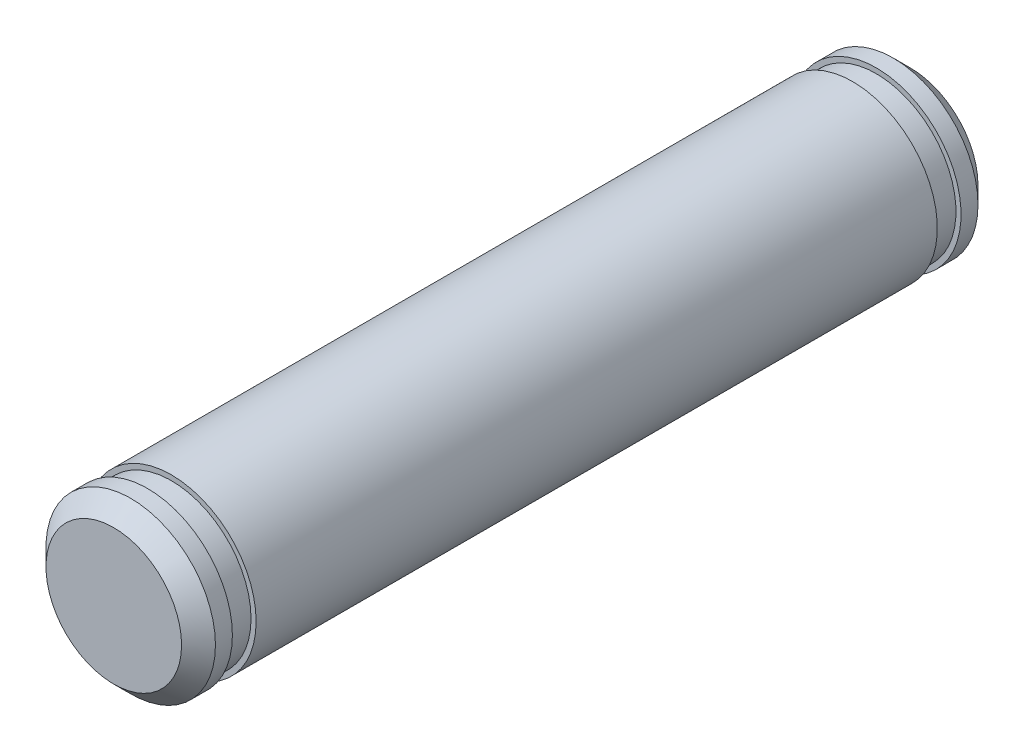
ISO-10303-21;
HEADER;
FILE_DESCRIPTION(('STEP AP214'),'2;1');
FILE_NAME('part.step','',(''),(''),'','','');
FILE_SCHEMA(('AUTOMOTIVE_DESIGN { 1 0 10303 214 1 1 1 1 }'));
ENDSEC;
DATA;
#1=APPLICATION_CONTEXT('core data for automotive mechanical design processes');
#2=APPLICATION_PROTOCOL_DEFINITION('international standard','automotive_design',2000,#1);
#3=PRODUCT_CONTEXT('',#1,'mechanical');
#4=PRODUCT('Part','Part','',(#3));
#5=PRODUCT_RELATED_PRODUCT_CATEGORY('part','',(#4));
#6=PRODUCT_DEFINITION_FORMATION('','',#4);
#7=PRODUCT_DEFINITION_CONTEXT('part definition',#1,'design');
#8=PRODUCT_DEFINITION('design','',#6,#7);
#9=PRODUCT_DEFINITION_SHAPE('','',#8);
#10=(LENGTH_UNIT() NAMED_UNIT(*) SI_UNIT(.MILLI.,.METRE.));
#11=(NAMED_UNIT(*) PLANE_ANGLE_UNIT() SI_UNIT($,.RADIAN.));
#12=(NAMED_UNIT(*) SI_UNIT($,.STERADIAN.) SOLID_ANGLE_UNIT());
#13=UNCERTAINTY_MEASURE_WITH_UNIT(LENGTH_MEASURE(1.E-05),#10,'distance_accuracy_value','');
#14=(GEOMETRIC_REPRESENTATION_CONTEXT(3) GLOBAL_UNCERTAINTY_ASSIGNED_CONTEXT((#13)) GLOBAL_UNIT_ASSIGNED_CONTEXT((#10,
#11,#12)) REPRESENTATION_CONTEXT('',''));
#15=CARTESIAN_POINT('',(0.,0.,0.));
#16=DIRECTION('',(0.,0.,1.));
#17=DIRECTION('',(1.,0.,0.));
#18=AXIS2_PLACEMENT_3D('',#15,#16,#17);
#19=CARTESIAN_POINT('',(0.,0.,23.5));
#20=DIRECTION('',(0.,0.,-1.));
#21=DIRECTION('',(-1.,0.,0.));
#22=AXIS2_PLACEMENT_3D('',#19,#20,#21);
#23=CYLINDRICAL_SURFACE('',#22,2.5);
#24=CARTESIAN_POINT('',(0.,0.,21.8));
#25=DIRECTION('',(0.,0.,1.));
#26=DIRECTION('',(1.,0.,0.));
#27=AXIS2_PLACEMENT_3D('',#24,#25,#26);
#28=CIRCLE('',#27,2.5);
#29=CARTESIAN_POINT('',(2.5,0.,21.8));
#30=VERTEX_POINT('',#29);
#31=EDGE_CURVE('E54',#30,#30,#28,.T.);
#32=ORIENTED_EDGE('',*,*,#31,.F.);
#33=EDGE_LOOP('',(#32));
#34=FACE_BOUND('',#33,.T.);
#35=CARTESIAN_POINT('',(0.,0.,1.7));
#36=DIRECTION('',(0.,0.,-1.));
#37=DIRECTION('',(-1.,0.,0.));
#38=AXIS2_PLACEMENT_3D('',#35,#36,#37);
#39=CIRCLE('',#38,2.5);
#40=CARTESIAN_POINT('',(-2.5,0.,1.7));
#41=VERTEX_POINT('',#40);
#42=EDGE_CURVE('E64',#41,#41,#39,.T.);
#43=ORIENTED_EDGE('',*,*,#42,.F.);
#44=EDGE_LOOP('',(#43));
#45=FACE_BOUND('',#44,.T.);
#46=ADVANCED_FACE('F33',(#34,#45),#23,.T.);
#47=CARTESIAN_POINT('',(0.,0.,21.8));
#48=DIRECTION('',(0.,0.,1.));
#49=DIRECTION('',(1.,0.,0.));
#50=AXIS2_PLACEMENT_3D('',#47,#48,#49);
#51=PLANE('',#50);
#52=CARTESIAN_POINT('',(0.,0.,21.8));
#53=DIRECTION('',(0.,0.,1.));
#54=DIRECTION('',(1.,0.,0.));
#55=AXIS2_PLACEMENT_3D('',#52,#53,#54);
#56=CIRCLE('',#55,2.35);
#57=CARTESIAN_POINT('',(2.35,0.,21.8));
#58=VERTEX_POINT('',#57);
#59=EDGE_CURVE('E58',#58,#58,#56,.T.);
#60=ORIENTED_EDGE('',*,*,#59,.F.);
#61=EDGE_LOOP('',(#60));
#62=FACE_BOUND('',#61,.T.);
#63=ORIENTED_EDGE('',*,*,#31,.T.);
#64=EDGE_LOOP('',(#63));
#65=FACE_BOUND('',#64,.T.);
#66=ADVANCED_FACE('F91',(#62,#65),#51,.T.);
#67=CARTESIAN_POINT('',(0.,0.,22.5));
#68=DIRECTION('',(0.,0.,1.));
#69=DIRECTION('',(1.,0.,0.));
#70=AXIS2_PLACEMENT_3D('',#67,#68,#69);
#71=PLANE('',#70);
#72=CARTESIAN_POINT('',(0.,0.,22.5));
#73=DIRECTION('',(0.,0.,1.));
#74=DIRECTION('',(1.,0.,0.));
#75=AXIS2_PLACEMENT_3D('',#72,#73,#74);
#76=CIRCLE('',#75,2.35);
#77=CARTESIAN_POINT('',(2.35,0.,22.5));
#78=VERTEX_POINT('',#77);
#79=EDGE_CURVE('E61',#78,#78,#76,.T.);
#80=ORIENTED_EDGE('',*,*,#79,.T.);
#81=EDGE_LOOP('',(#80));
#82=FACE_BOUND('',#81,.T.);
#83=CARTESIAN_POINT('',(0.,0.,22.5));
#84=DIRECTION('',(0.,0.,1.));
#85=DIRECTION('',(1.,0.,0.));
#86=AXIS2_PLACEMENT_3D('',#83,#84,#85);
#87=CIRCLE('',#86,2.5);
#88=CARTESIAN_POINT('',(2.5,0.,22.5));
#89=VERTEX_POINT('',#88);
#90=EDGE_CURVE('E55',#89,#89,#87,.T.);
#91=ORIENTED_EDGE('',*,*,#90,.F.);
#92=EDGE_LOOP('',(#91));
#93=FACE_BOUND('',#92,.T.);
#94=ADVANCED_FACE('F98',(#82,#93),#71,.F.);
#95=CARTESIAN_POINT('',(0.,0.,21.8));
#96=DIRECTION('',(0.,0.,1.));
#97=DIRECTION('',(1.,0.,0.));
#98=AXIS2_PLACEMENT_3D('',#95,#96,#97);
#99=CYLINDRICAL_SURFACE('',#98,2.35);
#100=ORIENTED_EDGE('',*,*,#59,.T.);
#101=EDGE_LOOP('',(#100));
#102=FACE_BOUND('',#101,.T.);
#103=ORIENTED_EDGE('',*,*,#79,.F.);
#104=EDGE_LOOP('',(#103));
#105=FACE_BOUND('',#104,.T.);
#106=ADVANCED_FACE('F119',(#102,#105),#99,.T.);
#107=CARTESIAN_POINT('',(0.,0.,23.5));
#108=DIRECTION('',(0.,0.,1.));
#109=DIRECTION('',(1.,0.,0.));
#110=AXIS2_PLACEMENT_3D('',#107,#108,#109);
#111=PLANE('',#110);
#112=CARTESIAN_POINT('',(0.,0.,23.5));
#113=DIRECTION('',(0.,0.,1.));
#114=DIRECTION('',(1.,0.,0.));
#115=AXIS2_PLACEMENT_3D('',#112,#113,#114);
#116=CIRCLE('',#115,2.);
#117=CARTESIAN_POINT('',(2.,0.,23.5));
#118=VERTEX_POINT('',#117);
#119=EDGE_CURVE('E10',#118,#118,#116,.T.);
#120=ORIENTED_EDGE('',*,*,#119,.T.);
#121=EDGE_LOOP('',(#120));
#122=FACE_BOUND('',#121,.T.);
#123=ADVANCED_FACE('F111',(#122),#111,.T.);
#124=CARTESIAN_POINT('',(0.,0.,23.5));
#125=DIRECTION('',(0.,0.,-1.));
#126=DIRECTION('',(-1.,0.,0.));
#127=AXIS2_PLACEMENT_3D('',#124,#125,#126);
#128=CONICAL_SURFACE('',#127,2.,0.785398163397446);
#129=CARTESIAN_POINT('',(0.,0.,23.));
#130=DIRECTION('',(0.,0.,1.));
#131=DIRECTION('',(1.,0.,0.));
#132=AXIS2_PLACEMENT_3D('',#129,#130,#131);
#133=CIRCLE('',#132,2.5);
#134=CARTESIAN_POINT('',(2.5,0.,23.));
#135=VERTEX_POINT('',#134);
#136=EDGE_CURVE('E49',#135,#135,#133,.F.);
#137=ORIENTED_EDGE('',*,*,#136,.F.);
#138=EDGE_LOOP('',(#137));
#139=FACE_BOUND('',#138,.T.);
#140=ORIENTED_EDGE('',*,*,#119,.F.);
#141=EDGE_LOOP('',(#140));
#142=FACE_BOUND('',#141,.T.);
#143=ADVANCED_FACE('F36',(#139,#142),#128,.T.);
#144=ORIENTED_EDGE('',*,*,#90,.T.);
#145=EDGE_LOOP('',(#144));
#146=FACE_BOUND('',#145,.T.);
#147=ORIENTED_EDGE('',*,*,#136,.T.);
#148=EDGE_LOOP('',(#147));
#149=FACE_BOUND('',#148,.T.);
#150=ADVANCED_FACE('F86',(#146,#149),#23,.T.);
#151=CARTESIAN_POINT('',(0.,0.,1.7));
#152=DIRECTION('',(0.,0.,-1.));
#153=DIRECTION('',(-1.,0.,0.));
#154=AXIS2_PLACEMENT_3D('',#151,#152,#153);
#155=PLANE('',#154);
#156=CARTESIAN_POINT('',(0.,0.,1.7));
#157=DIRECTION('',(0.,0.,-1.));
#158=DIRECTION('',(-1.,0.,0.));
#159=AXIS2_PLACEMENT_3D('',#156,#157,#158);
#160=CIRCLE('',#159,2.35);
#161=CARTESIAN_POINT('',(-2.35,0.,1.7));
#162=VERTEX_POINT('',#161);
#163=EDGE_CURVE('E70',#162,#162,#160,.T.);
#164=ORIENTED_EDGE('',*,*,#163,.F.);
#165=EDGE_LOOP('',(#164));
#166=FACE_BOUND('',#165,.T.);
#167=ORIENTED_EDGE('',*,*,#42,.T.);
#168=EDGE_LOOP('',(#167));
#169=FACE_BOUND('',#168,.T.);
#170=ADVANCED_FACE('F82',(#166,#169),#155,.T.);
#171=CARTESIAN_POINT('',(0.,0.,1.));
#172=DIRECTION('',(0.,0.,-1.));
#173=DIRECTION('',(-1.,0.,0.));
#174=AXIS2_PLACEMENT_3D('',#171,#172,#173);
#175=PLANE('',#174);
#176=CARTESIAN_POINT('',(0.,0.,1.));
#177=DIRECTION('',(0.,0.,-1.));
#178=DIRECTION('',(-1.,0.,0.));
#179=AXIS2_PLACEMENT_3D('',#176,#177,#178);
#180=CIRCLE('',#179,2.35);
#181=CARTESIAN_POINT('',(-2.35,0.,1.));
#182=VERTEX_POINT('',#181);
#183=EDGE_CURVE('E73',#182,#182,#180,.T.);
#184=ORIENTED_EDGE('',*,*,#183,.T.);
#185=EDGE_LOOP('',(#184));
#186=FACE_BOUND('',#185,.T.);
#187=CARTESIAN_POINT('',(0.,0.,1.));
#188=DIRECTION('',(0.,0.,-1.));
#189=DIRECTION('',(-1.,0.,0.));
#190=AXIS2_PLACEMENT_3D('',#187,#188,#189);
#191=CIRCLE('',#190,2.5);
#192=CARTESIAN_POINT('',(-2.5,0.,1.));
#193=VERTEX_POINT('',#192);
#194=EDGE_CURVE('E67',#193,#193,#191,.T.);
#195=ORIENTED_EDGE('',*,*,#194,.F.);
#196=EDGE_LOOP('',(#195));
#197=FACE_BOUND('',#196,.T.);
#198=ADVANCED_FACE('F85',(#186,#197),#175,.F.);
#199=CARTESIAN_POINT('',(0.,0.,1.7));
#200=DIRECTION('',(0.,0.,-1.));
#201=DIRECTION('',(-1.,0.,0.));
#202=AXIS2_PLACEMENT_3D('',#199,#200,#201);
#203=CYLINDRICAL_SURFACE('',#202,2.35);
#204=ORIENTED_EDGE('',*,*,#163,.T.);
#205=EDGE_LOOP('',(#204));
#206=FACE_BOUND('',#205,.T.);
#207=ORIENTED_EDGE('',*,*,#183,.F.);
#208=EDGE_LOOP('',(#207));
#209=FACE_BOUND('',#208,.T.);
#210=ADVANCED_FACE('F79',(#206,#209),#203,.T.);
#211=CARTESIAN_POINT('',(0.,0.,0.));
#212=DIRECTION('',(0.,0.,1.));
#213=DIRECTION('',(1.,0.,0.));
#214=AXIS2_PLACEMENT_3D('',#211,#212,#213);
#215=PLANE('',#214);
#216=CARTESIAN_POINT('',(0.,0.,0.));
#217=DIRECTION('',(0.,0.,1.));
#218=DIRECTION('',(1.,0.,0.));
#219=AXIS2_PLACEMENT_3D('',#216,#217,#218);
#220=CIRCLE('',#219,1.99999999999999);
#221=CARTESIAN_POINT('',(1.99999999999999,0.,0.));
#222=VERTEX_POINT('',#221);
#223=EDGE_CURVE('E41',#222,#222,#220,.F.);
#224=ORIENTED_EDGE('',*,*,#223,.T.);
#225=EDGE_LOOP('',(#224));
#226=FACE_BOUND('',#225,.T.);
#227=ADVANCED_FACE('F129',(#226),#215,.F.);
#228=CARTESIAN_POINT('',(0.,0.,0.500000000000007));
#229=DIRECTION('',(0.,0.,1.));
#230=DIRECTION('',(1.,0.,0.));
#231=AXIS2_PLACEMENT_3D('',#228,#229,#230);
#232=CONICAL_SURFACE('',#231,2.5,0.78539816339745);
#233=ORIENTED_EDGE('',*,*,#223,.F.);
#234=EDGE_LOOP('',(#233));
#235=FACE_BOUND('',#234,.T.);
#236=CARTESIAN_POINT('',(0.,0.,0.500000000000007));
#237=DIRECTION('',(0.,0.,1.));
#238=DIRECTION('',(1.,0.,0.));
#239=AXIS2_PLACEMENT_3D('',#236,#237,#238);
#240=CIRCLE('',#239,2.5);
#241=CARTESIAN_POINT('',(2.5,0.,0.500000000000007));
#242=VERTEX_POINT('',#241);
#243=EDGE_CURVE('E45',#242,#242,#240,.T.);
#244=ORIENTED_EDGE('',*,*,#243,.F.);
#245=EDGE_LOOP('',(#244));
#246=FACE_BOUND('',#245,.T.);
#247=ADVANCED_FACE('F104',(#235,#246),#232,.T.);
#248=ORIENTED_EDGE('',*,*,#194,.T.);
#249=EDGE_LOOP('',(#248));
#250=FACE_BOUND('',#249,.T.);
#251=ORIENTED_EDGE('',*,*,#243,.T.);
#252=EDGE_LOOP('',(#251));
#253=FACE_BOUND('',#252,.T.);
#254=ADVANCED_FACE('F94',(#250,#253),#23,.T.);
#255=CLOSED_SHELL('',(#46,#66,#94,#106,#123,#143,#150,#170,#198,#210,#227,#247,#254));
#256=MANIFOLD_SOLID_BREP('B2',#255);
#257=ADVANCED_BREP_SHAPE_REPRESENTATION('',(#18,#256),#14);
#258=SHAPE_DEFINITION_REPRESENTATION(#9,#257);
ENDSEC;
END-ISO-10303-21;
